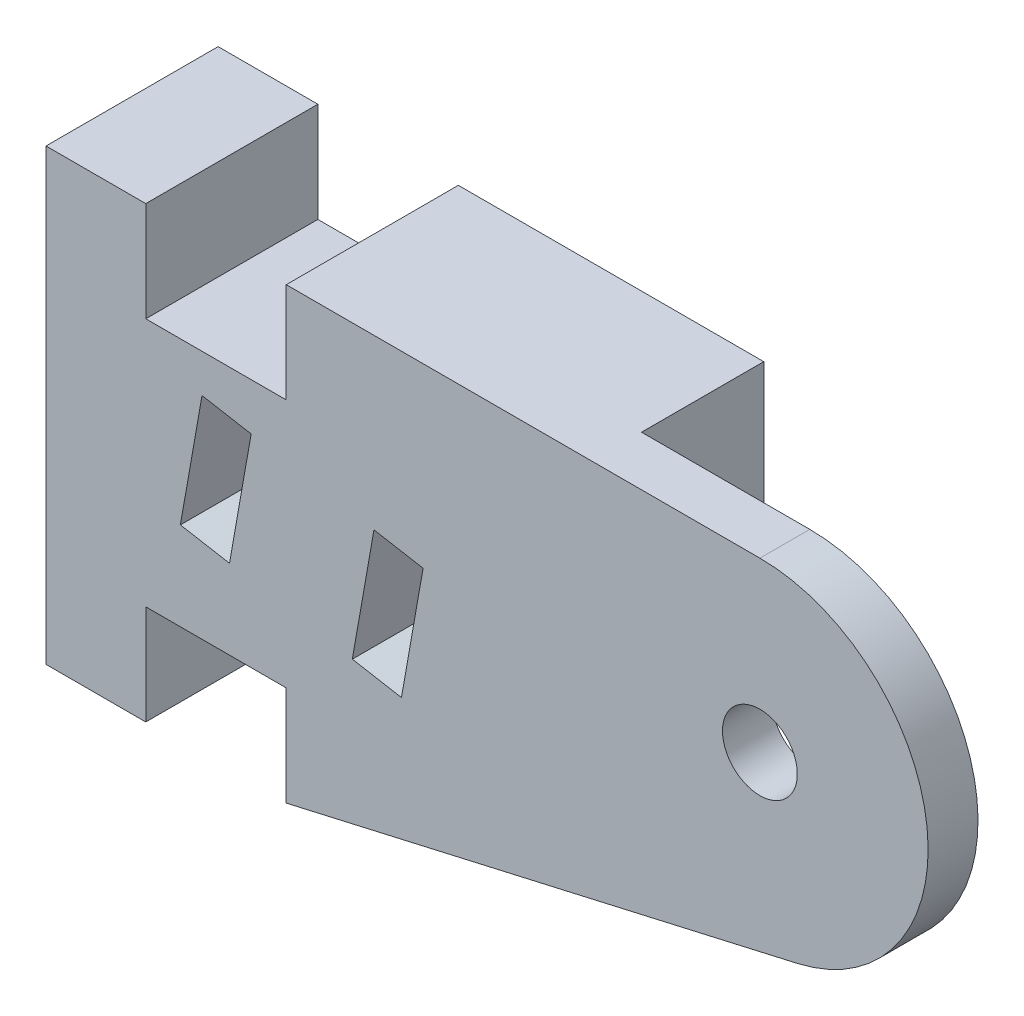
ISO-10303-21;
HEADER;
FILE_DESCRIPTION(('STEP AP214'),'2;1');
FILE_NAME('part.step','',(''),(''),'','','');
FILE_SCHEMA(('AUTOMOTIVE_DESIGN { 1 0 10303 214 1 1 1 1 }'));
ENDSEC;
DATA;
#1=APPLICATION_CONTEXT('core data for automotive mechanical design processes');
#2=APPLICATION_PROTOCOL_DEFINITION('international standard','automotive_design',2000,#1);
#3=PRODUCT_CONTEXT('',#1,'mechanical');
#4=PRODUCT('Part','Part','',(#3));
#5=PRODUCT_RELATED_PRODUCT_CATEGORY('part','',(#4));
#6=PRODUCT_DEFINITION_FORMATION('','',#4);
#7=PRODUCT_DEFINITION_CONTEXT('part definition',#1,'design');
#8=PRODUCT_DEFINITION('design','',#6,#7);
#9=PRODUCT_DEFINITION_SHAPE('','',#8);
#10=(LENGTH_UNIT() NAMED_UNIT(*) SI_UNIT(.MILLI.,.METRE.));
#11=(NAMED_UNIT(*) PLANE_ANGLE_UNIT() SI_UNIT($,.RADIAN.));
#12=(NAMED_UNIT(*) SI_UNIT($,.STERADIAN.) SOLID_ANGLE_UNIT());
#13=UNCERTAINTY_MEASURE_WITH_UNIT(LENGTH_MEASURE(1.E-05),#10,'distance_accuracy_value','');
#14=(GEOMETRIC_REPRESENTATION_CONTEXT(3) GLOBAL_UNCERTAINTY_ASSIGNED_CONTEXT((#13)) GLOBAL_UNIT_ASSIGNED_CONTEXT((#10,
#11,#12)) REPRESENTATION_CONTEXT('',''));
#15=CARTESIAN_POINT('',(0.,0.,0.));
#16=DIRECTION('',(0.,0.,1.));
#17=DIRECTION('',(1.,0.,0.));
#18=AXIS2_PLACEMENT_3D('',#15,#16,#17);
#19=CARTESIAN_POINT('',(28.6215163494173,11.255296940567,0.));
#20=DIRECTION('',(0.,0.,-1.));
#21=DIRECTION('',(-1.,0.,0.));
#22=AXIS2_PLACEMENT_3D('',#19,#20,#21);
#23=PLANE('',#22);
#24=DIRECTION('',(-0.984807753012207,0.173648177666934,0.));
#25=VECTOR('',#24,1.);
#26=CARTESIAN_POINT('',(6.25542113055713,12.4616417672485,0.));
#27=LINE('',#26,#25);
#28=CARTESIAN_POINT('',(8.22503663658155,12.1143454119147,0.));
#29=VERTEX_POINT('',#28);
#30=CARTESIAN_POINT('',(6.25542113055713,12.4616417672485,0.));
#31=VERTEX_POINT('',#30);
#32=EDGE_CURVE('E214',#29,#31,#27,.T.);
#33=ORIENTED_EDGE('',*,*,#32,.T.);
#34=DIRECTION('',(-0.173648177666931,-0.984807753012208,0.));
#35=VECTOR('',#34,1.);
#36=CARTESIAN_POINT('',(5.38718024222247,7.53760300218747,0.));
#37=LINE('',#36,#35);
#38=CARTESIAN_POINT('',(5.38718024222247,7.53760300218747,0.));
#39=VERTEX_POINT('',#38);
#40=EDGE_CURVE('E221',#31,#39,#37,.T.);
#41=ORIENTED_EDGE('',*,*,#40,.T.);
#42=DIRECTION('',(0.984807753012208,-0.173648177666931,0.));
#43=VECTOR('',#42,1.);
#44=CARTESIAN_POINT('',(7.3567957482469,7.19030664685361,0.));
#45=LINE('',#44,#43);
#46=CARTESIAN_POINT('',(7.3567957482469,7.19030664685361,0.));
#47=VERTEX_POINT('',#46);
#48=EDGE_CURVE('E224',#39,#47,#45,.T.);
#49=ORIENTED_EDGE('',*,*,#48,.T.);
#50=DIRECTION('',(0.173648177666931,0.984807753012208,0.));
#51=VECTOR('',#50,1.);
#52=CARTESIAN_POINT('',(7.3567957482469,7.19030664685361,0.));
#53=LINE('',#52,#51);
#54=EDGE_CURVE('E227',#47,#29,#53,.T.);
#55=ORIENTED_EDGE('',*,*,#54,.T.);
#56=EDGE_LOOP('',(#33,#41,#49,#55));
#57=FACE_BOUND('',#56,.T.);
#58=DIRECTION('',(-0.173648177666932,-0.984807753012208,0.));
#59=VECTOR('',#58,1.);
#60=CARTESIAN_POINT('',(12.280834513308,6.32206575851895,0.));
#61=LINE('',#60,#59);
#62=CARTESIAN_POINT('',(13.1490754016427,11.24610452358,0.));
#63=VERTEX_POINT('',#62);
#64=CARTESIAN_POINT('',(12.280834513308,6.32206575851895,0.));
#65=VERTEX_POINT('',#64);
#66=EDGE_CURVE('E244',#63,#65,#61,.T.);
#67=ORIENTED_EDGE('',*,*,#66,.T.);
#68=DIRECTION('',(0.984807753012208,-0.173648177666931,0.));
#69=VECTOR('',#68,1.);
#70=CARTESIAN_POINT('',(14.2504500193325,5.97476940318509,0.));
#71=LINE('',#70,#69);
#72=CARTESIAN_POINT('',(14.2504500193325,5.97476940318509,0.));
#73=VERTEX_POINT('',#72);
#74=EDGE_CURVE('E240',#65,#73,#71,.T.);
#75=ORIENTED_EDGE('',*,*,#74,.T.);
#76=DIRECTION('',(0.173648177666932,0.984807753012208,0.));
#77=VECTOR('',#76,1.);
#78=CARTESIAN_POINT('',(14.2504500193325,5.97476940318509,0.));
#79=LINE('',#78,#77);
#80=CARTESIAN_POINT('',(15.1186909076671,10.8988081682461,0.));
#81=VERTEX_POINT('',#80);
#82=EDGE_CURVE('E254',#73,#81,#79,.T.);
#83=ORIENTED_EDGE('',*,*,#82,.T.);
#84=DIRECTION('',(-0.98480775301221,0.173648177666921,0.));
#85=VECTOR('',#84,1.);
#86=CARTESIAN_POINT('',(13.1490754016427,11.24610452358,0.));
#87=LINE('',#86,#85);
#88=EDGE_CURVE('E257',#81,#63,#87,.T.);
#89=ORIENTED_EDGE('',*,*,#88,.T.);
#90=EDGE_LOOP('',(#67,#75,#83,#89));
#91=FACE_BOUND('',#90,.T.);
#92=DIRECTION('',(-1.,0.,0.));
#93=VECTOR('',#92,1.);
#94=CARTESIAN_POINT('',(9.63151634941732,18.0003410835651,0.));
#95=LINE('',#94,#93);
#96=CARTESIAN_POINT('',(21.8764722064192,18.0003410835651,0.));
#97=VERTEX_POINT('',#96);
#98=CARTESIAN_POINT('',(9.63151634941732,18.0003410835651,0.));
#99=VERTEX_POINT('',#98);
#100=EDGE_CURVE('E274',#97,#99,#95,.T.);
#101=ORIENTED_EDGE('',*,*,#100,.F.);
#102=DIRECTION('',(0.,-1.,0.));
#103=VECTOR('',#102,1.);
#104=CARTESIAN_POINT('',(21.8764722064192,18.0003410835651,0.));
#105=LINE('',#104,#103);
#106=CARTESIAN_POINT('',(21.8764722064192,2.79629402216892,0.));
#107=VERTEX_POINT('',#106);
#108=EDGE_CURVE('E188',#97,#107,#105,.T.);
#109=ORIENTED_EDGE('',*,*,#108,.T.);
#110=DIRECTION('',(0.974902640939778,0.222631625535649,0.));
#111=VECTOR('',#110,1.);
#112=CARTESIAN_POINT('',(9.63151634941733,0.,0.));
#113=LINE('',#112,#111);
#114=CARTESIAN_POINT('',(9.63151634941733,0.,0.));
#115=VERTEX_POINT('',#114);
#116=EDGE_CURVE('E279',#115,#107,#113,.T.);
#117=ORIENTED_EDGE('',*,*,#116,.F.);
#118=DIRECTION('',(0.,-1.,0.));
#119=VECTOR('',#118,1.);
#120=CARTESIAN_POINT('',(9.63151634941733,0.,0.));
#121=LINE('',#120,#119);
#122=CARTESIAN_POINT('',(9.63151634941733,4.,0.));
#123=VERTEX_POINT('',#122);
#124=EDGE_CURVE('E318',#123,#115,#121,.T.);
#125=ORIENTED_EDGE('',*,*,#124,.F.);
#126=DIRECTION('',(1.,0.,0.));
#127=VECTOR('',#126,1.);
#128=CARTESIAN_POINT('',(9.63151634941733,4.,0.));
#129=LINE('',#128,#127);
#130=CARTESIAN_POINT('',(4.,4.,0.));
#131=VERTEX_POINT('',#130);
#132=EDGE_CURVE('E316',#131,#123,#129,.T.);
#133=ORIENTED_EDGE('',*,*,#132,.F.);
#134=DIRECTION('',(0.,1.,0.));
#135=VECTOR('',#134,1.);
#136=CARTESIAN_POINT('',(4.,0.,0.));
#137=LINE('',#136,#135);
#138=CARTESIAN_POINT('',(4.,0.,0.));
#139=VERTEX_POINT('',#138);
#140=EDGE_CURVE('E314',#139,#131,#137,.T.);
#141=ORIENTED_EDGE('',*,*,#140,.F.);
#142=DIRECTION('',(1.,0.,0.));
#143=VECTOR('',#142,1.);
#144=CARTESIAN_POINT('',(0.,0.,0.));
#145=LINE('',#144,#143);
#146=CARTESIAN_POINT('',(0.,0.,0.));
#147=VERTEX_POINT('',#146);
#148=EDGE_CURVE('E312',#147,#139,#145,.T.);
#149=ORIENTED_EDGE('',*,*,#148,.F.);
#150=DIRECTION('',(0.,-1.,0.));
#151=VECTOR('',#150,1.);
#152=CARTESIAN_POINT('',(0.,0.,0.));
#153=LINE('',#152,#151);
#154=CARTESIAN_POINT('',(0.,18.0003410835651,0.));
#155=VERTEX_POINT('',#154);
#156=EDGE_CURVE('E310',#155,#147,#153,.T.);
#157=ORIENTED_EDGE('',*,*,#156,.F.);
#158=DIRECTION('',(-1.,0.,0.));
#159=VECTOR('',#158,1.);
#160=CARTESIAN_POINT('',(0.,18.0003410835651,0.));
#161=LINE('',#160,#159);
#162=CARTESIAN_POINT('',(4.,18.0003410835651,0.));
#163=VERTEX_POINT('',#162);
#164=EDGE_CURVE('E308',#163,#155,#161,.T.);
#165=ORIENTED_EDGE('',*,*,#164,.F.);
#166=DIRECTION('',(0.,1.,0.));
#167=VECTOR('',#166,1.);
#168=CARTESIAN_POINT('',(4.,18.0003410835651,0.));
#169=LINE('',#168,#167);
#170=CARTESIAN_POINT('',(4.,14.0003410835651,0.));
#171=VERTEX_POINT('',#170);
#172=EDGE_CURVE('E306',#171,#163,#169,.T.);
#173=ORIENTED_EDGE('',*,*,#172,.F.);
#174=DIRECTION('',(-1.,0.,0.));
#175=VECTOR('',#174,1.);
#176=CARTESIAN_POINT('',(9.63151634941733,14.0003410835651,0.));
#177=LINE('',#176,#175);
#178=CARTESIAN_POINT('',(9.63151634941733,14.0003410835651,0.));
#179=VERTEX_POINT('',#178);
#180=EDGE_CURVE('E304',#179,#171,#177,.T.);
#181=ORIENTED_EDGE('',*,*,#180,.F.);
#182=DIRECTION('',(0.,-1.,0.));
#183=VECTOR('',#182,1.);
#184=CARTESIAN_POINT('',(9.63151634941732,18.0003410835651,0.));
#185=LINE('',#184,#183);
#186=EDGE_CURVE('E302',#99,#179,#185,.T.);
#187=ORIENTED_EDGE('',*,*,#186,.F.);
#188=EDGE_LOOP('',(#101,#109,#117,#125,#133,#141,#149,#157,#165,#173,#181,#187));
#189=FACE_BOUND('',#188,.T.);
#190=ADVANCED_FACE('F32',(#57,#91,#189),#23,.T.);
#191=CARTESIAN_POINT('',(9.63151634941732,18.0003410835651,6.9));
#192=DIRECTION('',(0.,-1.,0.));
#193=DIRECTION('',(1.,0.,0.));
#194=AXIS2_PLACEMENT_3D('',#191,#192,#193);
#195=PLANE('',#194);
#196=DIRECTION('',(0.,0.,-1.));
#197=VECTOR('',#196,1.);
#198=CARTESIAN_POINT('',(21.8764722064192,18.0003410835651,4.9));
#199=LINE('',#198,#197);
#200=CARTESIAN_POINT('',(21.8764722064192,18.0003410835651,4.9));
#201=VERTEX_POINT('',#200);
#202=EDGE_CURVE('E183',#201,#97,#199,.T.);
#203=ORIENTED_EDGE('',*,*,#202,.T.);
#204=ORIENTED_EDGE('',*,*,#100,.T.);
#205=DIRECTION('',(0.,0.,-1.));
#206=VECTOR('',#205,1.);
#207=CARTESIAN_POINT('',(9.63151634941732,18.0003410835651,6.9));
#208=LINE('',#207,#206);
#209=CARTESIAN_POINT('',(9.63151634941732,18.0003410835651,6.9));
#210=VERTEX_POINT('',#209);
#211=EDGE_CURVE('E11',#210,#99,#208,.T.);
#212=ORIENTED_EDGE('',*,*,#211,.F.);
#213=DIRECTION('',(-1.,0.,0.));
#214=VECTOR('',#213,1.);
#215=CARTESIAN_POINT('',(9.63151634941732,18.0003410835651,6.9));
#216=LINE('',#215,#214);
#217=CARTESIAN_POINT('',(28.6215163494173,18.0003410835651,6.9));
#218=VERTEX_POINT('',#217);
#219=EDGE_CURVE('E275',#218,#210,#216,.T.);
#220=ORIENTED_EDGE('',*,*,#219,.F.);
#221=DIRECTION('',(0.,0.,-1.));
#222=VECTOR('',#221,1.);
#223=CARTESIAN_POINT('',(28.6215163494173,18.0003410835651,6.9));
#224=LINE('',#223,#222);
#225=CARTESIAN_POINT('',(28.6215163494173,18.0003410835651,4.9));
#226=VERTEX_POINT('',#225);
#227=EDGE_CURVE('E202',#218,#226,#224,.T.);
#228=ORIENTED_EDGE('',*,*,#227,.T.);
#229=DIRECTION('',(-1.,0.,0.));
#230=VECTOR('',#229,1.);
#231=CARTESIAN_POINT('',(21.8764722064192,18.0003410835651,4.9));
#232=LINE('',#231,#230);
#233=EDGE_CURVE('E49',#226,#201,#232,.T.);
#234=ORIENTED_EDGE('',*,*,#233,.T.);
#235=EDGE_LOOP('',(#203,#204,#212,#220,#228,#234));
#236=FACE_BOUND('',#235,.T.);
#237=ADVANCED_FACE('F34',(#236),#195,.F.);
#238=CARTESIAN_POINT('',(9.63151634941733,0.,6.9));
#239=DIRECTION('',(-0.222631625535649,0.974902640939778,0.));
#240=DIRECTION('',(-0.974902640939779,-0.222631625535649,0.));
#241=AXIS2_PLACEMENT_3D('',#238,#239,#240);
#242=PLANE('',#241);
#243=DIRECTION('',(0.,0.,-1.));
#244=VECTOR('',#243,1.);
#245=CARTESIAN_POINT('',(21.8764722064192,2.79629402216892,4.9));
#246=LINE('',#245,#244);
#247=CARTESIAN_POINT('',(21.8764722064192,2.79629402216892,4.9));
#248=VERTEX_POINT('',#247);
#249=EDGE_CURVE('E192',#248,#107,#246,.T.);
#250=ORIENTED_EDGE('',*,*,#249,.F.);
#251=DIRECTION('',(0.974902640939778,0.222631625535649,0.));
#252=VECTOR('',#251,1.);
#253=CARTESIAN_POINT('',(21.8764722064192,2.79629402216892,4.9));
#254=LINE('',#253,#252);
#255=CARTESIAN_POINT('',(30.1231764912827,4.67953559230268,4.9));
#256=VERTEX_POINT('',#255);
#257=EDGE_CURVE('E196',#248,#256,#254,.T.);
#258=ORIENTED_EDGE('',*,*,#257,.T.);
#259=DIRECTION('',(0.,0.,-1.));
#260=VECTOR('',#259,1.);
#261=CARTESIAN_POINT('',(30.1231764912827,4.67953559230267,6.9));
#262=LINE('',#261,#260);
#263=CARTESIAN_POINT('',(30.1231764912827,4.67953559230267,6.9));
#264=VERTEX_POINT('',#263);
#265=EDGE_CURVE('E323',#264,#256,#262,.T.);
#266=ORIENTED_EDGE('',*,*,#265,.F.);
#267=DIRECTION('',(0.974902640939778,0.222631625535649,0.));
#268=VECTOR('',#267,1.);
#269=CARTESIAN_POINT('',(9.63151634941733,0.,6.9));
#270=LINE('',#269,#268);
#271=CARTESIAN_POINT('',(9.63151634941733,0.,6.9));
#272=VERTEX_POINT('',#271);
#273=EDGE_CURVE('E297',#272,#264,#270,.T.);
#274=ORIENTED_EDGE('',*,*,#273,.F.);
#275=DIRECTION('',(0.,0.,-1.));
#276=VECTOR('',#275,1.);
#277=CARTESIAN_POINT('',(9.63151634941733,0.,6.9));
#278=LINE('',#277,#276);
#279=EDGE_CURVE('E326',#272,#115,#278,.T.);
#280=ORIENTED_EDGE('',*,*,#279,.T.);
#281=ORIENTED_EDGE('',*,*,#116,.T.);
#282=EDGE_LOOP('',(#250,#258,#266,#274,#280,#281));
#283=FACE_BOUND('',#282,.T.);
#284=ADVANCED_FACE('F375',(#283),#242,.F.);
#285=CARTESIAN_POINT('',(28.6215163494173,11.255296940567,6.9));
#286=DIRECTION('',(0.,0.,-1.));
#287=DIRECTION('',(-1.,0.,0.));
#288=AXIS2_PLACEMENT_3D('',#285,#286,#287);
#289=CYLINDRICAL_SURFACE('',#288,6.74504414299815);
#290=CARTESIAN_POINT('',(28.6215163494173,11.2552969405669,4.9));
#291=DIRECTION('',(0.,0.,1.));
#292=DIRECTION('',(-1.,0.,0.));
#293=AXIS2_PLACEMENT_3D('',#290,#291,#292);
#294=CIRCLE('',#293,6.74504414299814);
#295=EDGE_CURVE('E203',#256,#226,#294,.T.);
#296=ORIENTED_EDGE('',*,*,#295,.T.);
#297=ORIENTED_EDGE('',*,*,#227,.F.);
#298=CARTESIAN_POINT('',(28.6215163494173,11.255296940567,6.9));
#299=DIRECTION('',(0.,0.,1.));
#300=DIRECTION('',(-1.,0.,0.));
#301=AXIS2_PLACEMENT_3D('',#298,#299,#300);
#302=CIRCLE('',#301,6.74504414299815);
#303=EDGE_CURVE('E299',#264,#218,#302,.T.);
#304=ORIENTED_EDGE('',*,*,#303,.F.);
#305=ORIENTED_EDGE('',*,*,#265,.T.);
#306=EDGE_LOOP('',(#296,#297,#304,#305));
#307=FACE_BOUND('',#306,.T.);
#308=ADVANCED_FACE('F381',(#307),#289,.T.);
#309=CARTESIAN_POINT('',(28.6215163494173,11.255296940567,6.9));
#310=DIRECTION('',(0.,0.,-1.));
#311=DIRECTION('',(-1.,0.,0.));
#312=AXIS2_PLACEMENT_3D('',#309,#310,#311);
#313=CYLINDRICAL_SURFACE('',#312,1.4999999999987);
#314=CARTESIAN_POINT('',(28.6215163494173,11.255296940567,6.9));
#315=DIRECTION('',(0.,0.,1.));
#316=DIRECTION('',(-1.,0.,0.));
#317=AXIS2_PLACEMENT_3D('',#314,#315,#316);
#318=CIRCLE('',#317,1.4999999999987);
#319=CARTESIAN_POINT('',(27.1215163494186,11.255296940567,6.9));
#320=VERTEX_POINT('',#319);
#321=EDGE_CURVE('E271',#320,#320,#318,.T.);
#322=CARTESIAN_POINT('',(28.6215163494173,11.255296940567,4.9));
#323=DIRECTION('',(0.,0.,-1.));
#324=DIRECTION('',(-1.,0.,0.));
#325=AXIS2_PLACEMENT_3D('',#322,#323,#324);
#326=CIRCLE('',#325,1.4999999999987);
#327=CARTESIAN_POINT('',(27.1215163494186,11.255296940567,4.9));
#328=VERTEX_POINT('',#327);
#329=EDGE_CURVE('E191',#328,#328,#326,.T.);
#330=CARTESIAN_POINT('',(27.1215163494186,11.255296940567,6.9));
#331=CARTESIAN_POINT('',(27.1215163494186,11.255296940567,6.87916666666667));
#332=CARTESIAN_POINT('',(27.1215163494186,11.255296940567,6.85833333333333));
#333=CARTESIAN_POINT('',(27.1215163494186,11.255296940567,6.81666666666667));
#334=CARTESIAN_POINT('',(27.1215163494186,11.255296940567,6.79583333333333));
#335=CARTESIAN_POINT('',(27.1215163494186,11.255296940567,6.75416666666667));
#336=CARTESIAN_POINT('',(27.1215163494186,11.255296940567,6.73333333333333));
#337=CARTESIAN_POINT('',(27.1215163494186,11.255296940567,6.69166666666667));
#338=CARTESIAN_POINT('',(27.1215163494186,11.255296940567,6.67083333333333));
#339=CARTESIAN_POINT('',(27.1215163494186,11.255296940567,6.62916666666667));
#340=CARTESIAN_POINT('',(27.1215163494186,11.255296940567,6.60833333333333));
#341=CARTESIAN_POINT('',(27.1215163494186,11.255296940567,6.56666666666667));
#342=CARTESIAN_POINT('',(27.1215163494186,11.255296940567,6.54583333333333));
#343=CARTESIAN_POINT('',(27.1215163494186,11.255296940567,6.50416666666667));
#344=CARTESIAN_POINT('',(27.1215163494186,11.255296940567,6.48333333333333));
#345=CARTESIAN_POINT('',(27.1215163494186,11.255296940567,6.44166666666667));
#346=CARTESIAN_POINT('',(27.1215163494186,11.255296940567,6.42083333333333));
#347=CARTESIAN_POINT('',(27.1215163494186,11.255296940567,6.37916666666667));
#348=CARTESIAN_POINT('',(27.1215163494186,11.255296940567,6.35833333333333));
#349=CARTESIAN_POINT('',(27.1215163494186,11.255296940567,6.31666666666667));
#350=CARTESIAN_POINT('',(27.1215163494186,11.255296940567,6.29583333333333));
#351=CARTESIAN_POINT('',(27.1215163494186,11.255296940567,6.25416666666667));
#352=CARTESIAN_POINT('',(27.1215163494186,11.255296940567,6.23333333333333));
#353=CARTESIAN_POINT('',(27.1215163494186,11.255296940567,6.19166666666667));
#354=CARTESIAN_POINT('',(27.1215163494186,11.255296940567,6.17083333333333));
#355=CARTESIAN_POINT('',(27.1215163494186,11.255296940567,6.12916666666667));
#356=CARTESIAN_POINT('',(27.1215163494186,11.255296940567,6.10833333333333));
#357=CARTESIAN_POINT('',(27.1215163494186,11.255296940567,6.06666666666667));
#358=CARTESIAN_POINT('',(27.1215163494186,11.255296940567,6.04583333333333));
#359=CARTESIAN_POINT('',(27.1215163494186,11.255296940567,6.00416666666667));
#360=CARTESIAN_POINT('',(27.1215163494186,11.255296940567,5.98333333333333));
#361=CARTESIAN_POINT('',(27.1215163494186,11.255296940567,5.94166666666667));
#362=CARTESIAN_POINT('',(27.1215163494186,11.255296940567,5.92083333333333));
#363=CARTESIAN_POINT('',(27.1215163494186,11.255296940567,5.87916666666667));
#364=CARTESIAN_POINT('',(27.1215163494186,11.255296940567,5.85833333333333));
#365=CARTESIAN_POINT('',(27.1215163494186,11.255296940567,5.81666666666667));
#366=CARTESIAN_POINT('',(27.1215163494186,11.255296940567,5.79583333333333));
#367=CARTESIAN_POINT('',(27.1215163494186,11.255296940567,5.75416666666667));
#368=CARTESIAN_POINT('',(27.1215163494186,11.255296940567,5.73333333333333));
#369=CARTESIAN_POINT('',(27.1215163494186,11.255296940567,5.69166666666667));
#370=CARTESIAN_POINT('',(27.1215163494186,11.255296940567,5.67083333333333));
#371=CARTESIAN_POINT('',(27.1215163494186,11.255296940567,5.62916666666667));
#372=CARTESIAN_POINT('',(27.1215163494186,11.255296940567,5.60833333333333));
#373=CARTESIAN_POINT('',(27.1215163494186,11.255296940567,5.56666666666667));
#374=CARTESIAN_POINT('',(27.1215163494186,11.255296940567,5.54583333333333));
#375=CARTESIAN_POINT('',(27.1215163494186,11.255296940567,5.50416666666667));
#376=CARTESIAN_POINT('',(27.1215163494186,11.255296940567,5.48333333333333));
#377=CARTESIAN_POINT('',(27.1215163494186,11.255296940567,5.44166666666667));
#378=CARTESIAN_POINT('',(27.1215163494186,11.255296940567,5.42083333333333));
#379=CARTESIAN_POINT('',(27.1215163494186,11.255296940567,5.37916666666667));
#380=CARTESIAN_POINT('',(27.1215163494186,11.255296940567,5.35833333333334));
#381=CARTESIAN_POINT('',(27.1215163494186,11.255296940567,5.31666666666667));
#382=CARTESIAN_POINT('',(27.1215163494186,11.255296940567,5.29583333333333));
#383=CARTESIAN_POINT('',(27.1215163494186,11.255296940567,5.25416666666667));
#384=CARTESIAN_POINT('',(27.1215163494186,11.255296940567,5.23333333333333));
#385=CARTESIAN_POINT('',(27.1215163494186,11.255296940567,5.19166666666667));
#386=CARTESIAN_POINT('',(27.1215163494186,11.255296940567,5.17083333333333));
#387=CARTESIAN_POINT('',(27.1215163494186,11.255296940567,5.12916666666667));
#388=CARTESIAN_POINT('',(27.1215163494186,11.255296940567,5.10833333333333));
#389=CARTESIAN_POINT('',(27.1215163494186,11.255296940567,5.06666666666667));
#390=CARTESIAN_POINT('',(27.1215163494186,11.255296940567,5.04583333333333));
#391=CARTESIAN_POINT('',(27.1215163494186,11.255296940567,5.00416666666667));
#392=CARTESIAN_POINT('',(27.1215163494186,11.255296940567,4.98333333333333));
#393=CARTESIAN_POINT('',(27.1215163494186,11.255296940567,4.94166666666667));
#394=CARTESIAN_POINT('',(27.1215163494186,11.255296940567,4.92083333333333));
#395=CARTESIAN_POINT('',(27.1215163494186,11.255296940567,4.9));
#396=B_SPLINE_CURVE_WITH_KNOTS('',3,(#330,#331,#332,#333,#334,#335,#336,#337,#338,#339,#340,
#341,#342,#343,#344,#345,#346,#347,#348,#349,#350,#351,#352,#353,#354,#355,#356,#357,#358,#359,
#360,#361,#362,#363,#364,#365,#366,#367,#368,#369,#370,#371,#372,#373,#374,#375,#376,#377,#378,
#379,#380,#381,#382,#383,#384,#385,#386,#387,#388,#389,#390,#391,#392,#393,#394,#395),
.UNSPECIFIED.,.F.,.F.,(4,2,2,2,2,2,2,2,2,2,2,2,2,2,2,2,2,2,2,2,2,2,2,2,2,2,2,2,2,2,2,2,4),(0.,
0.0624999999999992,0.124999999999999,0.187499999999999,0.249999999999999,0.312499999999999,
0.374999999999999,0.4375,0.5,0.5625,0.625,0.687499999999999,0.749999999999999,0.812499999999999,
0.874999999999999,0.937499999999999,0.999999999999999,1.0625,1.125,1.1875,1.25,1.3125,1.375,
1.4375,1.5,1.5625,1.625,1.6875,1.75,1.8125,1.875,1.9375,2.),.UNSPECIFIED.);
#397=EDGE_CURVE('BSEAM354',#320,#328,#396,.T.);
#398=ORIENTED_EDGE('',*,*,#321,.T.);
#399=ORIENTED_EDGE('',*,*,#329,.T.);
#400=ORIENTED_EDGE('',*,*,#397,.T.);
#401=ORIENTED_EDGE('',*,*,#397,.F.);
#402=EDGE_LOOP('',(#398,#400,#399,#401));
#403=FACE_BOUND('',#402,.T.);
#404=ADVANCED_FACE('F354',(#403),#313,.F.);
#405=CARTESIAN_POINT('',(28.6215163494173,11.255296940567,6.9));
#406=DIRECTION('',(0.,0.,-1.));
#407=DIRECTION('',(-1.,0.,0.));
#408=AXIS2_PLACEMENT_3D('',#405,#406,#407);
#409=PLANE('',#408);
#410=DIRECTION('',(0.984807753012208,-0.173648177666931,0.));
#411=VECTOR('',#410,1.);
#412=CARTESIAN_POINT('',(14.2504500193325,5.97476940318509,6.9));
#413=LINE('',#412,#411);
#414=CARTESIAN_POINT('',(12.280834513308,6.32206575851895,6.9));
#415=VERTEX_POINT('',#414);
#416=CARTESIAN_POINT('',(14.2504500193325,5.97476940318509,6.9));
#417=VERTEX_POINT('',#416);
#418=EDGE_CURVE('E241',#415,#417,#413,.T.);
#419=ORIENTED_EDGE('',*,*,#418,.F.);
#420=DIRECTION('',(-0.173648177666932,-0.984807753012208,0.));
#421=VECTOR('',#420,1.);
#422=CARTESIAN_POINT('',(12.280834513308,6.32206575851895,6.9));
#423=LINE('',#422,#421);
#424=CARTESIAN_POINT('',(13.1490754016427,11.24610452358,6.9));
#425=VERTEX_POINT('',#424);
#426=EDGE_CURVE('E249',#425,#415,#423,.T.);
#427=ORIENTED_EDGE('',*,*,#426,.F.);
#428=DIRECTION('',(-0.98480775301221,0.173648177666921,0.));
#429=VECTOR('',#428,1.);
#430=CARTESIAN_POINT('',(13.1490754016427,11.24610452358,6.9));
#431=LINE('',#430,#429);
#432=CARTESIAN_POINT('',(15.1186909076671,10.8988081682461,6.9));
#433=VERTEX_POINT('',#432);
#434=EDGE_CURVE('E246',#433,#425,#431,.T.);
#435=ORIENTED_EDGE('',*,*,#434,.F.);
#436=DIRECTION('',(0.173648177666932,0.984807753012208,0.));
#437=VECTOR('',#436,1.);
#438=CARTESIAN_POINT('',(14.2504500193325,5.97476940318509,6.9));
#439=LINE('',#438,#437);
#440=EDGE_CURVE('E243',#417,#433,#439,.T.);
#441=ORIENTED_EDGE('',*,*,#440,.F.);
#442=EDGE_LOOP('',(#419,#427,#435,#441));
#443=FACE_BOUND('',#442,.T.);
#444=ORIENTED_EDGE('',*,*,#219,.T.);
#445=DIRECTION('',(0.,-1.,0.));
#446=VECTOR('',#445,1.);
#447=CARTESIAN_POINT('',(9.63151634941732,18.0003410835651,6.9));
#448=LINE('',#447,#446);
#449=CARTESIAN_POINT('',(9.63151634941733,14.0003410835651,6.9));
#450=VERTEX_POINT('',#449);
#451=EDGE_CURVE('E278',#210,#450,#448,.T.);
#452=ORIENTED_EDGE('',*,*,#451,.T.);
#453=DIRECTION('',(-1.,0.,0.));
#454=VECTOR('',#453,1.);
#455=CARTESIAN_POINT('',(9.63151634941733,14.0003410835651,6.9));
#456=LINE('',#455,#454);
#457=CARTESIAN_POINT('',(4.,14.0003410835651,6.9));
#458=VERTEX_POINT('',#457);
#459=EDGE_CURVE('E281',#450,#458,#456,.T.);
#460=ORIENTED_EDGE('',*,*,#459,.T.);
#461=DIRECTION('',(0.,1.,0.));
#462=VECTOR('',#461,1.);
#463=CARTESIAN_POINT('',(4.,18.0003410835651,6.9));
#464=LINE('',#463,#462);
#465=CARTESIAN_POINT('',(4.,18.0003410835651,6.9));
#466=VERTEX_POINT('',#465);
#467=EDGE_CURVE('E283',#458,#466,#464,.T.);
#468=ORIENTED_EDGE('',*,*,#467,.T.);
#469=DIRECTION('',(-1.,0.,0.));
#470=VECTOR('',#469,1.);
#471=CARTESIAN_POINT('',(0.,18.0003410835651,6.9));
#472=LINE('',#471,#470);
#473=CARTESIAN_POINT('',(0.,18.0003410835651,6.9));
#474=VERTEX_POINT('',#473);
#475=EDGE_CURVE('E285',#466,#474,#472,.T.);
#476=ORIENTED_EDGE('',*,*,#475,.T.);
#477=DIRECTION('',(0.,-1.,0.));
#478=VECTOR('',#477,1.);
#479=CARTESIAN_POINT('',(0.,0.,6.9));
#480=LINE('',#479,#478);
#481=CARTESIAN_POINT('',(0.,0.,6.9));
#482=VERTEX_POINT('',#481);
#483=EDGE_CURVE('E287',#474,#482,#480,.T.);
#484=ORIENTED_EDGE('',*,*,#483,.T.);
#485=DIRECTION('',(1.,0.,0.));
#486=VECTOR('',#485,1.);
#487=CARTESIAN_POINT('',(0.,0.,6.9));
#488=LINE('',#487,#486);
#489=CARTESIAN_POINT('',(4.,0.,6.9));
#490=VERTEX_POINT('',#489);
#491=EDGE_CURVE('E289',#482,#490,#488,.T.);
#492=ORIENTED_EDGE('',*,*,#491,.T.);
#493=DIRECTION('',(0.,1.,0.));
#494=VECTOR('',#493,1.);
#495=CARTESIAN_POINT('',(4.,0.,6.9));
#496=LINE('',#495,#494);
#497=CARTESIAN_POINT('',(4.,4.,6.9));
#498=VERTEX_POINT('',#497);
#499=EDGE_CURVE('E291',#490,#498,#496,.T.);
#500=ORIENTED_EDGE('',*,*,#499,.T.);
#501=DIRECTION('',(1.,0.,0.));
#502=VECTOR('',#501,1.);
#503=CARTESIAN_POINT('',(9.63151634941733,4.,6.9));
#504=LINE('',#503,#502);
#505=CARTESIAN_POINT('',(9.63151634941733,4.,6.9));
#506=VERTEX_POINT('',#505);
#507=EDGE_CURVE('E293',#498,#506,#504,.T.);
#508=ORIENTED_EDGE('',*,*,#507,.T.);
#509=DIRECTION('',(0.,-1.,0.));
#510=VECTOR('',#509,1.);
#511=CARTESIAN_POINT('',(9.63151634941733,0.,6.9));
#512=LINE('',#511,#510);
#513=EDGE_CURVE('E295',#506,#272,#512,.T.);
#514=ORIENTED_EDGE('',*,*,#513,.T.);
#515=ORIENTED_EDGE('',*,*,#273,.T.);
#516=ORIENTED_EDGE('',*,*,#303,.T.);
#517=EDGE_LOOP('',(#444,#452,#460,#468,#476,#484,#492,#500,#508,#514,#515,#516));
#518=FACE_BOUND('',#517,.T.);
#519=ORIENTED_EDGE('',*,*,#321,.F.);
#520=EDGE_LOOP('',(#519));
#521=FACE_BOUND('',#520,.T.);
#522=DIRECTION('',(-0.173648177666931,-0.984807753012208,0.));
#523=VECTOR('',#522,1.);
#524=CARTESIAN_POINT('',(5.38718024222247,7.53760300218747,6.9));
#525=LINE('',#524,#523);
#526=CARTESIAN_POINT('',(6.25542113055713,12.4616417672485,6.9));
#527=VERTEX_POINT('',#526);
#528=CARTESIAN_POINT('',(5.38718024222247,7.53760300218747,6.9));
#529=VERTEX_POINT('',#528);
#530=EDGE_CURVE('E211',#527,#529,#525,.T.);
#531=ORIENTED_EDGE('',*,*,#530,.F.);
#532=DIRECTION('',(-0.984807753012207,0.173648177666934,0.));
#533=VECTOR('',#532,1.);
#534=CARTESIAN_POINT('',(6.25542113055713,12.4616417672485,6.9));
#535=LINE('',#534,#533);
#536=CARTESIAN_POINT('',(8.22503663658156,12.1143454119147,6.9));
#537=VERTEX_POINT('',#536);
#538=EDGE_CURVE('E218',#537,#527,#535,.T.);
#539=ORIENTED_EDGE('',*,*,#538,.F.);
#540=DIRECTION('',(0.173648177666931,0.984807753012208,0.));
#541=VECTOR('',#540,1.);
#542=CARTESIAN_POINT('',(7.3567957482469,7.19030664685361,6.9));
#543=LINE('',#542,#541);
#544=CARTESIAN_POINT('',(7.3567957482469,7.19030664685361,6.9));
#545=VERTEX_POINT('',#544);
#546=EDGE_CURVE('E216',#545,#537,#543,.T.);
#547=ORIENTED_EDGE('',*,*,#546,.F.);
#548=DIRECTION('',(0.984807753012208,-0.173648177666931,0.));
#549=VECTOR('',#548,1.);
#550=CARTESIAN_POINT('',(7.3567957482469,7.19030664685361,6.9));
#551=LINE('',#550,#549);
#552=EDGE_CURVE('E213',#529,#545,#551,.T.);
#553=ORIENTED_EDGE('',*,*,#552,.F.);
#554=EDGE_LOOP('',(#531,#539,#547,#553));
#555=FACE_BOUND('',#554,.T.);
#556=ADVANCED_FACE('F379',(#443,#518,#521,#555),#409,.F.);
#557=CARTESIAN_POINT('',(9.63151634941732,18.0003410835651,6.9));
#558=DIRECTION('',(1.,0.,0.));
#559=DIRECTION('',(0.,1.,0.));
#560=AXIS2_PLACEMENT_3D('',#557,#558,#559);
#561=PLANE('',#560);
#562=ORIENTED_EDGE('',*,*,#186,.T.);
#563=DIRECTION('',(0.,0.,-1.));
#564=VECTOR('',#563,1.);
#565=CARTESIAN_POINT('',(9.63151634941733,14.0003410835651,6.9));
#566=LINE('',#565,#564);
#567=EDGE_CURVE('E41',#450,#179,#566,.T.);
#568=ORIENTED_EDGE('',*,*,#567,.F.);
#569=ORIENTED_EDGE('',*,*,#451,.F.);
#570=ORIENTED_EDGE('',*,*,#211,.T.);
#571=EDGE_LOOP('',(#562,#568,#569,#570));
#572=FACE_BOUND('',#571,.T.);
#573=ADVANCED_FACE('F419',(#572),#561,.F.);
#574=CARTESIAN_POINT('',(9.63151634941733,14.0003410835651,6.9));
#575=DIRECTION('',(0.,-1.,0.));
#576=DIRECTION('',(1.,0.,0.));
#577=AXIS2_PLACEMENT_3D('',#574,#575,#576);
#578=PLANE('',#577);
#579=ORIENTED_EDGE('',*,*,#180,.T.);
#580=DIRECTION('',(0.,0.,-1.));
#581=VECTOR('',#580,1.);
#582=CARTESIAN_POINT('',(4.,14.0003410835651,6.9));
#583=LINE('',#582,#581);
#584=EDGE_CURVE('E347',#458,#171,#583,.T.);
#585=ORIENTED_EDGE('',*,*,#584,.F.);
#586=ORIENTED_EDGE('',*,*,#459,.F.);
#587=ORIENTED_EDGE('',*,*,#567,.T.);
#588=EDGE_LOOP('',(#579,#585,#586,#587));
#589=FACE_BOUND('',#588,.T.);
#590=ADVANCED_FACE('F416',(#589),#578,.F.);
#591=CARTESIAN_POINT('',(4.,18.0003410835651,6.9));
#592=DIRECTION('',(-1.,0.,0.));
#593=DIRECTION('',(0.,-1.,0.));
#594=AXIS2_PLACEMENT_3D('',#591,#592,#593);
#595=PLANE('',#594);
#596=ORIENTED_EDGE('',*,*,#172,.T.);
#597=DIRECTION('',(0.,0.,-1.));
#598=VECTOR('',#597,1.);
#599=CARTESIAN_POINT('',(4.,18.0003410835651,6.9));
#600=LINE('',#599,#598);
#601=EDGE_CURVE('E344',#466,#163,#600,.T.);
#602=ORIENTED_EDGE('',*,*,#601,.F.);
#603=ORIENTED_EDGE('',*,*,#467,.F.);
#604=ORIENTED_EDGE('',*,*,#584,.T.);
#605=EDGE_LOOP('',(#596,#602,#603,#604));
#606=FACE_BOUND('',#605,.T.);
#607=ADVANCED_FACE('F412',(#606),#595,.F.);
#608=CARTESIAN_POINT('',(0.,18.0003410835651,6.9));
#609=DIRECTION('',(0.,-1.,0.));
#610=DIRECTION('',(0.,0.,-1.));
#611=AXIS2_PLACEMENT_3D('',#608,#609,#610);
#612=PLANE('',#611);
#613=ORIENTED_EDGE('',*,*,#164,.T.);
#614=DIRECTION('',(0.,0.,-1.));
#615=VECTOR('',#614,1.);
#616=CARTESIAN_POINT('',(0.,18.0003410835651,6.9));
#617=LINE('',#616,#615);
#618=EDGE_CURVE('E341',#474,#155,#617,.T.);
#619=ORIENTED_EDGE('',*,*,#618,.F.);
#620=ORIENTED_EDGE('',*,*,#475,.F.);
#621=ORIENTED_EDGE('',*,*,#601,.T.);
#622=EDGE_LOOP('',(#613,#619,#620,#621));
#623=FACE_BOUND('',#622,.T.);
#624=ADVANCED_FACE('F408',(#623),#612,.F.);
#625=CARTESIAN_POINT('',(0.,0.,6.9));
#626=DIRECTION('',(1.,0.,0.));
#627=DIRECTION('',(0.,1.,0.));
#628=AXIS2_PLACEMENT_3D('',#625,#626,#627);
#629=PLANE('',#628);
#630=CARTESIAN_POINT('',(0.,10.0003410835651,2.45000000000001));
#631=DIRECTION('',(-1.,0.,0.));
#632=DIRECTION('',(0.,-1.,0.));
#633=AXIS2_PLACEMENT_3D('',#630,#631,#632);
#634=CIRCLE('',#633,1.);
#635=CARTESIAN_POINT('',(0.,9.00034108356507,2.45000000000001));
#636=VERTEX_POINT('',#635);
#637=EDGE_CURVE('E663',#636,#636,#634,.T.);
#638=ORIENTED_EDGE('',*,*,#637,.F.);
#639=EDGE_LOOP('',(#638));
#640=FACE_BOUND('',#639,.T.);
#641=ORIENTED_EDGE('',*,*,#156,.T.);
#642=DIRECTION('',(0.,0.,-1.));
#643=VECTOR('',#642,1.);
#644=CARTESIAN_POINT('',(0.,0.,6.9));
#645=LINE('',#644,#643);
#646=EDGE_CURVE('E338',#482,#147,#645,.T.);
#647=ORIENTED_EDGE('',*,*,#646,.F.);
#648=ORIENTED_EDGE('',*,*,#483,.F.);
#649=ORIENTED_EDGE('',*,*,#618,.T.);
#650=EDGE_LOOP('',(#641,#647,#648,#649));
#651=FACE_BOUND('',#650,.T.);
#652=ADVANCED_FACE('F404',(#640,#651),#629,.F.);
#653=CARTESIAN_POINT('',(0.,0.,6.9));
#654=DIRECTION('',(0.,1.,0.));
#655=DIRECTION('',(0.,0.,1.));
#656=AXIS2_PLACEMENT_3D('',#653,#654,#655);
#657=PLANE('',#656);
#658=ORIENTED_EDGE('',*,*,#148,.T.);
#659=DIRECTION('',(0.,0.,-1.));
#660=VECTOR('',#659,1.);
#661=CARTESIAN_POINT('',(4.,0.,6.9));
#662=LINE('',#661,#660);
#663=EDGE_CURVE('E335',#490,#139,#662,.T.);
#664=ORIENTED_EDGE('',*,*,#663,.F.);
#665=ORIENTED_EDGE('',*,*,#491,.F.);
#666=ORIENTED_EDGE('',*,*,#646,.T.);
#667=EDGE_LOOP('',(#658,#664,#665,#666));
#668=FACE_BOUND('',#667,.T.);
#669=ADVANCED_FACE('F400',(#668),#657,.F.);
#670=CARTESIAN_POINT('',(4.,0.,6.9));
#671=DIRECTION('',(-1.,0.,0.));
#672=DIRECTION('',(0.,0.,1.));
#673=AXIS2_PLACEMENT_3D('',#670,#671,#672);
#674=PLANE('',#673);
#675=ORIENTED_EDGE('',*,*,#140,.T.);
#676=DIRECTION('',(0.,0.,-1.));
#677=VECTOR('',#676,1.);
#678=CARTESIAN_POINT('',(4.,4.,6.9));
#679=LINE('',#678,#677);
#680=EDGE_CURVE('E332',#498,#131,#679,.T.);
#681=ORIENTED_EDGE('',*,*,#680,.F.);
#682=ORIENTED_EDGE('',*,*,#499,.F.);
#683=ORIENTED_EDGE('',*,*,#663,.T.);
#684=EDGE_LOOP('',(#675,#681,#682,#683));
#685=FACE_BOUND('',#684,.T.);
#686=ADVANCED_FACE('F396',(#685),#674,.F.);
#687=CARTESIAN_POINT('',(9.63151634941733,4.,6.9));
#688=DIRECTION('',(0.,1.,0.));
#689=DIRECTION('',(-1.,0.,0.));
#690=AXIS2_PLACEMENT_3D('',#687,#688,#689);
#691=PLANE('',#690);
#692=ORIENTED_EDGE('',*,*,#132,.T.);
#693=DIRECTION('',(0.,0.,-1.));
#694=VECTOR('',#693,1.);
#695=CARTESIAN_POINT('',(9.63151634941733,4.,6.9));
#696=LINE('',#695,#694);
#697=EDGE_CURVE('E329',#506,#123,#696,.T.);
#698=ORIENTED_EDGE('',*,*,#697,.F.);
#699=ORIENTED_EDGE('',*,*,#507,.F.);
#700=ORIENTED_EDGE('',*,*,#680,.T.);
#701=EDGE_LOOP('',(#692,#698,#699,#700));
#702=FACE_BOUND('',#701,.T.);
#703=ADVANCED_FACE('F392',(#702),#691,.F.);
#704=CARTESIAN_POINT('',(9.63151634941733,0.,6.9));
#705=DIRECTION('',(1.,0.,0.));
#706=DIRECTION('',(0.,0.,-1.));
#707=AXIS2_PLACEMENT_3D('',#704,#705,#706);
#708=PLANE('',#707);
#709=ORIENTED_EDGE('',*,*,#124,.T.);
#710=ORIENTED_EDGE('',*,*,#279,.F.);
#711=ORIENTED_EDGE('',*,*,#513,.F.);
#712=ORIENTED_EDGE('',*,*,#697,.T.);
#713=EDGE_LOOP('',(#709,#710,#711,#712));
#714=FACE_BOUND('',#713,.T.);
#715=ADVANCED_FACE('F388',(#714),#708,.F.);
#716=CARTESIAN_POINT('',(14.2504500193325,5.97476940318509,6.9));
#717=DIRECTION('',(0.173648177666931,0.984807753012208,0.));
#718=DIRECTION('',(-0.984807753012208,0.173648177666931,0.));
#719=AXIS2_PLACEMENT_3D('',#716,#717,#718);
#720=PLANE('',#719);
#721=ORIENTED_EDGE('',*,*,#74,.F.);
#722=DIRECTION('',(0.,0.,-1.));
#723=VECTOR('',#722,1.);
#724=CARTESIAN_POINT('',(12.280834513308,6.32206575851895,6.9));
#725=LINE('',#724,#723);
#726=EDGE_CURVE('E251',#415,#65,#725,.T.);
#727=ORIENTED_EDGE('',*,*,#726,.F.);
#728=ORIENTED_EDGE('',*,*,#418,.T.);
#729=DIRECTION('',(0.,0.,-1.));
#730=VECTOR('',#729,1.);
#731=CARTESIAN_POINT('',(14.2504500193325,5.97476940318509,6.9));
#732=LINE('',#731,#730);
#733=EDGE_CURVE('E268',#417,#73,#732,.T.);
#734=ORIENTED_EDGE('',*,*,#733,.T.);
#735=EDGE_LOOP('',(#721,#727,#728,#734));
#736=FACE_BOUND('',#735,.T.);
#737=ADVANCED_FACE('F391',(#736),#720,.T.);
#738=CARTESIAN_POINT('',(14.2504500193325,5.97476940318509,6.9));
#739=DIRECTION('',(-0.984807753012208,0.173648177666932,0.));
#740=DIRECTION('',(-0.173648177666932,-0.984807753012208,0.));
#741=AXIS2_PLACEMENT_3D('',#738,#739,#740);
#742=PLANE('',#741);
#743=CARTESIAN_POINT('',(14.6845704634998,8.43678878571558,2.45));
#744=DIRECTION('',(-0.984807753012208,0.173648177666932,0.));
#745=DIRECTION('',(-0.173648177666932,-0.984807753012208,0.));
#746=AXIS2_PLACEMENT_3D('',#743,#744,#745);
#747=CIRCLE('',#746,1.);
#748=CARTESIAN_POINT('',(14.5109222858329,7.45198103270338,2.45));
#749=VERTEX_POINT('',#748);
#750=EDGE_CURVE('E657',#749,#749,#747,.T.);
#751=ORIENTED_EDGE('',*,*,#750,.F.);
#752=EDGE_LOOP('',(#751));
#753=FACE_BOUND('',#752,.T.);
#754=ORIENTED_EDGE('',*,*,#82,.F.);
#755=ORIENTED_EDGE('',*,*,#733,.F.);
#756=ORIENTED_EDGE('',*,*,#440,.T.);
#757=DIRECTION('',(0.,0.,-1.));
#758=VECTOR('',#757,1.);
#759=CARTESIAN_POINT('',(15.1186909076671,10.8988081682461,6.9));
#760=LINE('',#759,#758);
#761=EDGE_CURVE('E266',#433,#81,#760,.T.);
#762=ORIENTED_EDGE('',*,*,#761,.T.);
#763=EDGE_LOOP('',(#754,#755,#756,#762));
#764=FACE_BOUND('',#763,.T.);
#765=ADVANCED_FACE('F497',(#753,#764),#742,.T.);
#766=CARTESIAN_POINT('',(13.1490754016427,11.24610452358,6.9));
#767=DIRECTION('',(-0.173648177666921,-0.98480775301221,0.));
#768=DIRECTION('',(0.98480775301221,-0.173648177666921,0.));
#769=AXIS2_PLACEMENT_3D('',#766,#767,#768);
#770=PLANE('',#769);
#771=ORIENTED_EDGE('',*,*,#88,.F.);
#772=ORIENTED_EDGE('',*,*,#761,.F.);
#773=ORIENTED_EDGE('',*,*,#434,.T.);
#774=DIRECTION('',(0.,0.,-1.));
#775=VECTOR('',#774,1.);
#776=CARTESIAN_POINT('',(13.1490754016427,11.24610452358,6.9));
#777=LINE('',#776,#775);
#778=EDGE_CURVE('E264',#425,#63,#777,.T.);
#779=ORIENTED_EDGE('',*,*,#778,.T.);
#780=EDGE_LOOP('',(#771,#772,#773,#779));
#781=FACE_BOUND('',#780,.T.);
#782=ADVANCED_FACE('F493',(#781),#770,.T.);
#783=CARTESIAN_POINT('',(12.280834513308,6.32206575851895,6.9));
#784=DIRECTION('',(0.984807753012208,-0.173648177666932,0.));
#785=DIRECTION('',(0.173648177666932,0.984807753012208,0.));
#786=AXIS2_PLACEMENT_3D('',#783,#784,#785);
#787=PLANE('',#786);
#788=CARTESIAN_POINT('',(12.7149549574754,8.78408514104945,2.45));
#789=DIRECTION('',(0.984807753012208,-0.173648177666932,0.));
#790=DIRECTION('',(0.173648177666932,0.984807753012208,0.));
#791=AXIS2_PLACEMENT_3D('',#788,#789,#790);
#792=CIRCLE('',#791,1.);
#793=CARTESIAN_POINT('',(12.8886031351423,9.76889289406166,2.45));
#794=VERTEX_POINT('',#793);
#795=EDGE_CURVE('E651',#794,#794,#792,.T.);
#796=ORIENTED_EDGE('',*,*,#795,.F.);
#797=EDGE_LOOP('',(#796));
#798=FACE_BOUND('',#797,.T.);
#799=ORIENTED_EDGE('',*,*,#66,.F.);
#800=ORIENTED_EDGE('',*,*,#778,.F.);
#801=ORIENTED_EDGE('',*,*,#426,.T.);
#802=ORIENTED_EDGE('',*,*,#726,.T.);
#803=EDGE_LOOP('',(#799,#800,#801,#802));
#804=FACE_BOUND('',#803,.T.);
#805=ADVANCED_FACE('F489',(#798,#804),#787,.T.);
#806=CARTESIAN_POINT('',(5.38718024222247,7.53760300218747,6.9));
#807=DIRECTION('',(0.984807753012208,-0.173648177666931,0.));
#808=DIRECTION('',(0.173648177666931,0.984807753012208,0.));
#809=AXIS2_PLACEMENT_3D('',#806,#807,#808);
#810=PLANE('',#809);
#811=CARTESIAN_POINT('',(5.82142741238754,10.0003410835651,2.45000000000001));
#812=DIRECTION('',(0.984807753012208,-0.173648177666931,0.));
#813=DIRECTION('',(-0.173648177666931,-0.984807753012208,0.));
#814=AXIS2_PLACEMENT_3D('',#811,#812,#813);
#815=ELLIPSE('',#814,1.01542661188575,1.);
#816=CARTESIAN_POINT('',(5.64510043167908,9.00034108356508,2.45000000000001));
#817=VERTEX_POINT('',#816);
#818=EDGE_CURVE('E36',#817,#817,#815,.T.);
#819=ORIENTED_EDGE('',*,*,#818,.F.);
#820=EDGE_LOOP('',(#819));
#821=FACE_BOUND('',#820,.T.);
#822=ORIENTED_EDGE('',*,*,#40,.F.);
#823=DIRECTION('',(0.,0.,-1.));
#824=VECTOR('',#823,1.);
#825=CARTESIAN_POINT('',(6.25542113055713,12.4616417672485,6.9));
#826=LINE('',#825,#824);
#827=EDGE_CURVE('E220',#527,#31,#826,.T.);
#828=ORIENTED_EDGE('',*,*,#827,.F.);
#829=ORIENTED_EDGE('',*,*,#530,.T.);
#830=DIRECTION('',(0.,0.,-1.));
#831=VECTOR('',#830,1.);
#832=CARTESIAN_POINT('',(5.38718024222247,7.53760300218747,6.9));
#833=LINE('',#832,#831);
#834=EDGE_CURVE('E237',#529,#39,#833,.T.);
#835=ORIENTED_EDGE('',*,*,#834,.T.);
#836=EDGE_LOOP('',(#822,#828,#829,#835));
#837=FACE_BOUND('',#836,.T.);
#838=ADVANCED_FACE('F471',(#821,#837),#810,.T.);
#839=CARTESIAN_POINT('',(7.3567957482469,7.19030664685361,6.9));
#840=DIRECTION('',(0.173648177666931,0.984807753012208,0.));
#841=DIRECTION('',(-0.984807753012208,0.173648177666931,0.));
#842=AXIS2_PLACEMENT_3D('',#839,#840,#841);
#843=PLANE('',#842);
#844=ORIENTED_EDGE('',*,*,#48,.F.);
#845=ORIENTED_EDGE('',*,*,#834,.F.);
#846=ORIENTED_EDGE('',*,*,#552,.T.);
#847=DIRECTION('',(0.,0.,-1.));
#848=VECTOR('',#847,1.);
#849=CARTESIAN_POINT('',(7.3567957482469,7.19030664685361,6.9));
#850=LINE('',#849,#848);
#851=EDGE_CURVE('E235',#545,#47,#850,.T.);
#852=ORIENTED_EDGE('',*,*,#851,.T.);
#853=EDGE_LOOP('',(#844,#845,#846,#852));
#854=FACE_BOUND('',#853,.T.);
#855=ADVANCED_FACE('F473',(#854),#843,.T.);
#856=CARTESIAN_POINT('',(7.3567957482469,7.19030664685361,6.9));
#857=DIRECTION('',(-0.984807753012208,0.173648177666931,0.));
#858=DIRECTION('',(-0.173648177666931,-0.984807753012208,0.));
#859=AXIS2_PLACEMENT_3D('',#856,#857,#858);
#860=PLANE('',#859);
#861=CARTESIAN_POINT('',(7.79091619241422,9.65232602938412,2.45));
#862=DIRECTION('',(-0.984807753012208,0.173648177666931,0.));
#863=DIRECTION('',(-0.173648177666931,-0.984807753012208,0.));
#864=AXIS2_PLACEMENT_3D('',#861,#862,#863);
#865=CIRCLE('',#864,1.);
#866=CARTESIAN_POINT('',(7.61726801474729,8.66751827637192,2.45));
#867=VERTEX_POINT('',#866);
#868=EDGE_CURVE('E654',#867,#867,#865,.T.);
#869=ORIENTED_EDGE('',*,*,#868,.F.);
#870=EDGE_LOOP('',(#869));
#871=FACE_BOUND('',#870,.T.);
#872=ORIENTED_EDGE('',*,*,#54,.F.);
#873=ORIENTED_EDGE('',*,*,#851,.F.);
#874=ORIENTED_EDGE('',*,*,#546,.T.);
#875=DIRECTION('',(0.,0.,-1.));
#876=VECTOR('',#875,1.);
#877=CARTESIAN_POINT('',(8.22503663658155,12.1143454119147,6.9));
#878=LINE('',#877,#876);
#879=EDGE_CURVE('E57',#537,#29,#878,.T.);
#880=ORIENTED_EDGE('',*,*,#879,.T.);
#881=EDGE_LOOP('',(#872,#873,#874,#880));
#882=FACE_BOUND('',#881,.T.);
#883=ADVANCED_FACE('F477',(#871,#882),#860,.T.);
#884=CARTESIAN_POINT('',(6.25542113055713,12.4616417672485,6.9));
#885=DIRECTION('',(-0.173648177666934,-0.984807753012207,0.));
#886=DIRECTION('',(0.984807753012207,-0.173648177666934,0.));
#887=AXIS2_PLACEMENT_3D('',#884,#885,#886);
#888=PLANE('',#887);
#889=ORIENTED_EDGE('',*,*,#32,.F.);
#890=ORIENTED_EDGE('',*,*,#879,.F.);
#891=ORIENTED_EDGE('',*,*,#538,.T.);
#892=ORIENTED_EDGE('',*,*,#827,.T.);
#893=EDGE_LOOP('',(#889,#890,#891,#892));
#894=FACE_BOUND('',#893,.T.);
#895=ADVANCED_FACE('F366',(#894),#888,.T.);
#896=CARTESIAN_POINT('',(21.8764722064192,18.0003410835651,4.9));
#897=DIRECTION('',(1.,0.,0.));
#898=DIRECTION('',(0.,0.,-1.));
#899=AXIS2_PLACEMENT_3D('',#896,#897,#898);
#900=PLANE('',#899);
#901=CARTESIAN_POINT('',(21.8764722064192,7.16866246583466,2.45));
#902=DIRECTION('',(1.,0.,0.));
#903=DIRECTION('',(0.,1.,0.));
#904=AXIS2_PLACEMENT_3D('',#901,#902,#903);
#905=ELLIPSE('',#904,1.01542661188574,1.);
#906=CARTESIAN_POINT('',(21.8764722064192,8.1840890777204,2.45));
#907=VERTEX_POINT('',#906);
#908=EDGE_CURVE('E655',#907,#907,#905,.F.);
#909=ORIENTED_EDGE('',*,*,#908,.T.);
#910=EDGE_LOOP('',(#909));
#911=FACE_BOUND('',#910,.T.);
#912=ORIENTED_EDGE('',*,*,#108,.F.);
#913=ORIENTED_EDGE('',*,*,#202,.F.);
#914=DIRECTION('',(0.,-1.,0.));
#915=VECTOR('',#914,1.);
#916=CARTESIAN_POINT('',(21.8764722064192,18.0003410835651,4.9));
#917=LINE('',#916,#915);
#918=EDGE_CURVE('E185',#201,#248,#917,.T.);
#919=ORIENTED_EDGE('',*,*,#918,.T.);
#920=ORIENTED_EDGE('',*,*,#249,.T.);
#921=EDGE_LOOP('',(#912,#913,#919,#920));
#922=FACE_BOUND('',#921,.T.);
#923=ADVANCED_FACE('F184',(#911,#922),#900,.T.);
#924=CARTESIAN_POINT('',(28.6215163494173,11.2552969405669,4.9));
#925=DIRECTION('',(0.,0.,-1.));
#926=DIRECTION('',(-1.,0.,0.));
#927=AXIS2_PLACEMENT_3D('',#924,#925,#926);
#928=PLANE('',#927);
#929=ORIENTED_EDGE('',*,*,#329,.F.);
#930=EDGE_LOOP('',(#929));
#931=FACE_BOUND('',#930,.T.);
#932=ORIENTED_EDGE('',*,*,#295,.F.);
#933=ORIENTED_EDGE('',*,*,#257,.F.);
#934=ORIENTED_EDGE('',*,*,#918,.F.);
#935=ORIENTED_EDGE('',*,*,#233,.F.);
#936=EDGE_LOOP('',(#932,#933,#934,#935));
#937=FACE_BOUND('',#936,.T.);
#938=ADVANCED_FACE('F194',(#931,#937),#928,.T.);
#939=CARTESIAN_POINT('',(6.99999999999999,10.0003410835651,2.45000000000001));
#940=DIRECTION('',(-1.,0.,0.));
#941=DIRECTION('',(0.,-1.,0.));
#942=AXIS2_PLACEMENT_3D('',#939,#940,#941);
#943=CYLINDRICAL_SURFACE('',#942,1.);
#944=ORIENTED_EDGE('',*,*,#818,.T.);
#945=EDGE_LOOP('',(#944));
#946=FACE_BOUND('',#945,.T.);
#947=ORIENTED_EDGE('',*,*,#637,.T.);
#948=EDGE_LOOP('',(#947));
#949=FACE_BOUND('',#948,.T.);
#950=ADVANCED_FACE('F357',(#946,#949),#943,.F.);
#951=CARTESIAN_POINT('',(24.6834142494323,6.6737228503665,2.45));
#952=DIRECTION('',(-0.984807753012208,0.173648177666931,0.));
#953=DIRECTION('',(-0.173648177666931,-0.984807753012208,0.));
#954=AXIS2_PLACEMENT_3D('',#951,#952,#953);
#955=CYLINDRICAL_SURFACE('',#954,1.);
#956=ORIENTED_EDGE('',*,*,#750,.T.);
#957=EDGE_LOOP('',(#956));
#958=FACE_BOUND('',#957,.T.);
#959=ORIENTED_EDGE('',*,*,#908,.F.);
#960=EDGE_LOOP('',(#959));
#961=FACE_BOUND('',#960,.T.);
#962=ADVANCED_FACE('F363',(#958,#961),#955,.F.);
#963=ORIENTED_EDGE('',*,*,#795,.T.);
#964=EDGE_LOOP('',(#963));
#965=FACE_BOUND('',#964,.T.);
#966=ORIENTED_EDGE('',*,*,#868,.T.);
#967=EDGE_LOOP('',(#966));
#968=FACE_BOUND('',#967,.T.);
#969=ADVANCED_FACE('F635',(#965,#968),#955,.F.);
#970=CLOSED_SHELL('',(#190,#237,#284,#308,#404,#556,#573,#590,#607,#624,#652,#669,#686,#703,
#715,#737,#765,#782,#805,#838,#855,#883,#895,#923,#938,#950,#962,#969));
#971=MANIFOLD_SOLID_BREP('B2',#970);
#972=ADVANCED_BREP_SHAPE_REPRESENTATION('',(#18,#971),#14);
#973=SHAPE_DEFINITION_REPRESENTATION(#9,#972);
ENDSEC;
END-ISO-10303-21;
